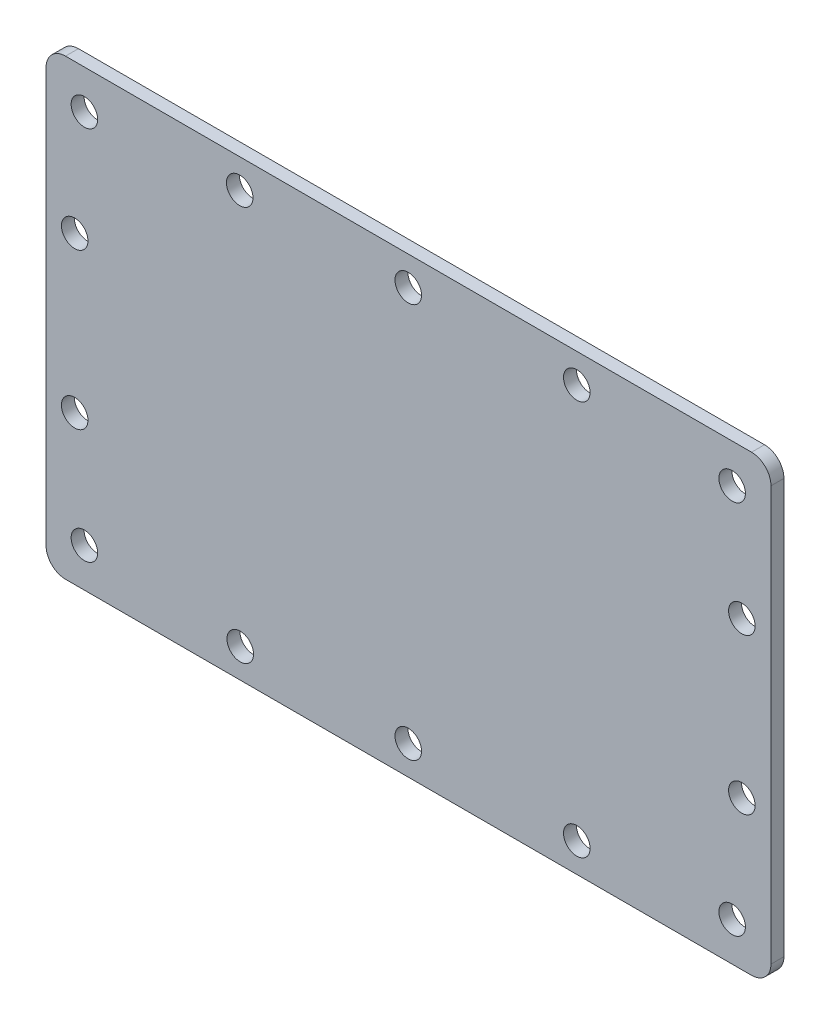
ISO-10303-21;
HEADER;
FILE_DESCRIPTION(('STEP AP214'),'2;1');
FILE_NAME('part.step','',(''),(''),'','','');
FILE_SCHEMA(('AUTOMOTIVE_DESIGN { 1 0 10303 214 1 1 1 1 }'));
ENDSEC;
DATA;
#1=APPLICATION_CONTEXT('core data for automotive mechanical design processes');
#2=APPLICATION_PROTOCOL_DEFINITION('international standard','automotive_design',2000,#1);
#3=PRODUCT_CONTEXT('',#1,'mechanical');
#4=PRODUCT('Part','Part','',(#3));
#5=PRODUCT_RELATED_PRODUCT_CATEGORY('part','',(#4));
#6=PRODUCT_DEFINITION_FORMATION('','',#4);
#7=PRODUCT_DEFINITION_CONTEXT('part definition',#1,'design');
#8=PRODUCT_DEFINITION('design','',#6,#7);
#9=PRODUCT_DEFINITION_SHAPE('','',#8);
#10=(LENGTH_UNIT() NAMED_UNIT(*) SI_UNIT(.MILLI.,.METRE.));
#11=(NAMED_UNIT(*) PLANE_ANGLE_UNIT() SI_UNIT($,.RADIAN.));
#12=(NAMED_UNIT(*) SI_UNIT($,.STERADIAN.) SOLID_ANGLE_UNIT());
#13=UNCERTAINTY_MEASURE_WITH_UNIT(LENGTH_MEASURE(1.E-05),#10,'distance_accuracy_value','');
#14=(GEOMETRIC_REPRESENTATION_CONTEXT(3) GLOBAL_UNCERTAINTY_ASSIGNED_CONTEXT((#13)) GLOBAL_UNIT_ASSIGNED_CONTEXT((#10,
#11,#12)) REPRESENTATION_CONTEXT('',''));
#15=CARTESIAN_POINT('',(0.,0.,0.));
#16=DIRECTION('',(0.,0.,1.));
#17=DIRECTION('',(1.,0.,0.));
#18=AXIS2_PLACEMENT_3D('',#15,#16,#17);
#19=CARTESIAN_POINT('',(-90.1914606741827,7.93230490078483,2.));
#20=DIRECTION('',(1.,0.,0.));
#21=DIRECTION('',(0.,1.,0.));
#22=AXIS2_PLACEMENT_3D('',#19,#20,#21);
#23=PLANE('',#22);
#24=DIRECTION('',(0.,-1.,0.));
#25=VECTOR('',#24,1.);
#26=CARTESIAN_POINT('',(-90.1914606741827,7.93230490078483,0.));
#27=LINE('',#26,#25);
#28=CARTESIAN_POINT('',(-90.1914606741827,4.93230490078483,0.));
#29=VERTEX_POINT('',#28);
#30=CARTESIAN_POINT('',(-90.1914606741827,-59.0676950992152,0.));
#31=VERTEX_POINT('',#30);
#32=EDGE_CURVE('E130',#29,#31,#27,.T.);
#33=ORIENTED_EDGE('',*,*,#32,.T.);
#34=DIRECTION('',(0.,0.,-1.));
#35=VECTOR('',#34,1.);
#36=CARTESIAN_POINT('',(-90.1914606741827,-59.0676950992152,2.));
#37=LINE('',#36,#35);
#38=CARTESIAN_POINT('',(-90.1914606741827,-59.0676950992152,2.));
#39=VERTEX_POINT('',#38);
#40=EDGE_CURVE('E107',#31,#39,#37,.F.);
#41=ORIENTED_EDGE('',*,*,#40,.T.);
#42=DIRECTION('',(0.,-1.,0.));
#43=VECTOR('',#42,1.);
#44=CARTESIAN_POINT('',(-90.1914606741827,7.93230490078483,2.));
#45=LINE('',#44,#43);
#46=CARTESIAN_POINT('',(-90.1914606741827,4.93230490078483,2.));
#47=VERTEX_POINT('',#46);
#48=EDGE_CURVE('E140',#47,#39,#45,.T.);
#49=ORIENTED_EDGE('',*,*,#48,.F.);
#50=DIRECTION('',(0.,0.,-1.));
#51=VECTOR('',#50,1.);
#52=CARTESIAN_POINT('',(-90.1914606741827,4.93230490078483,2.));
#53=LINE('',#52,#51);
#54=EDGE_CURVE('E112',#47,#29,#53,.T.);
#55=ORIENTED_EDGE('',*,*,#54,.T.);
#56=EDGE_LOOP('',(#33,#41,#49,#55));
#57=FACE_BOUND('',#56,.T.);
#58=ADVANCED_FACE('F33',(#57),#23,.F.);
#59=CARTESIAN_POINT('',(-90.1914606741827,-62.0676950992152,2.));
#60=DIRECTION('',(0.,1.,0.));
#61=DIRECTION('',(0.,0.,1.));
#62=AXIS2_PLACEMENT_3D('',#59,#60,#61);
#63=PLANE('',#62);
#64=DIRECTION('',(1.,0.,0.));
#65=VECTOR('',#64,1.);
#66=CARTESIAN_POINT('',(-90.1914606741827,-62.0676950992152,2.));
#67=LINE('',#66,#65);
#68=CARTESIAN_POINT('',(-87.1914606741827,-62.0676950992152,2.));
#69=VERTEX_POINT('',#68);
#70=CARTESIAN_POINT('',(18.8085393258173,-62.0676950992152,2.));
#71=VERTEX_POINT('',#70);
#72=EDGE_CURVE('E122',#69,#71,#67,.T.);
#73=ORIENTED_EDGE('',*,*,#72,.F.);
#74=DIRECTION('',(0.,0.,-1.));
#75=VECTOR('',#74,1.);
#76=CARTESIAN_POINT('',(-87.1914606741827,-62.0676950992152,2.));
#77=LINE('',#76,#75);
#78=CARTESIAN_POINT('',(-87.1914606741827,-62.0676950992152,0.));
#79=VERTEX_POINT('',#78);
#80=EDGE_CURVE('E106',#69,#79,#77,.T.);
#81=ORIENTED_EDGE('',*,*,#80,.T.);
#82=DIRECTION('',(1.,0.,0.));
#83=VECTOR('',#82,1.);
#84=CARTESIAN_POINT('',(-90.1914606741827,-62.0676950992152,0.));
#85=LINE('',#84,#83);
#86=CARTESIAN_POINT('',(18.8085393258173,-62.0676950992152,0.));
#87=VERTEX_POINT('',#86);
#88=EDGE_CURVE('E119',#79,#87,#85,.T.);
#89=ORIENTED_EDGE('',*,*,#88,.T.);
#90=DIRECTION('',(0.,0.,-1.));
#91=VECTOR('',#90,1.);
#92=CARTESIAN_POINT('',(18.8085393258173,-62.0676950992152,2.));
#93=LINE('',#92,#91);
#94=EDGE_CURVE('E124',#87,#71,#93,.F.);
#95=ORIENTED_EDGE('',*,*,#94,.T.);
#96=EDGE_LOOP('',(#73,#81,#89,#95));
#97=FACE_BOUND('',#96,.T.);
#98=ADVANCED_FACE('F118',(#97),#63,.F.);
#99=CARTESIAN_POINT('',(21.8085393258173,7.93230490078483,2.));
#100=DIRECTION('',(-1.,0.,0.));
#101=DIRECTION('',(0.,-1.,0.));
#102=AXIS2_PLACEMENT_3D('',#99,#100,#101);
#103=PLANE('',#102);
#104=DIRECTION('',(0.,1.,0.));
#105=VECTOR('',#104,1.);
#106=CARTESIAN_POINT('',(21.8085393258173,7.93230490078483,2.));
#107=LINE('',#106,#105);
#108=CARTESIAN_POINT('',(21.8085393258173,-59.0676950992152,2.));
#109=VERTEX_POINT('',#108);
#110=CARTESIAN_POINT('',(21.8085393258173,4.93230490078483,2.));
#111=VERTEX_POINT('',#110);
#112=EDGE_CURVE('E247',#109,#111,#107,.T.);
#113=ORIENTED_EDGE('',*,*,#112,.F.);
#114=DIRECTION('',(0.,0.,-1.));
#115=VECTOR('',#114,1.);
#116=CARTESIAN_POINT('',(21.8085393258173,-59.0676950992152,2.));
#117=LINE('',#116,#115);
#118=CARTESIAN_POINT('',(21.8085393258173,-59.0676950992152,0.));
#119=VERTEX_POINT('',#118);
#120=EDGE_CURVE('E11',#109,#119,#117,.T.);
#121=ORIENTED_EDGE('',*,*,#120,.T.);
#122=DIRECTION('',(0.,1.,0.));
#123=VECTOR('',#122,1.);
#124=CARTESIAN_POINT('',(21.8085393258173,7.93230490078483,0.));
#125=LINE('',#124,#123);
#126=CARTESIAN_POINT('',(21.8085393258173,4.93230490078483,0.));
#127=VERTEX_POINT('',#126);
#128=EDGE_CURVE('E129',#119,#127,#125,.T.);
#129=ORIENTED_EDGE('',*,*,#128,.T.);
#130=DIRECTION('',(0.,0.,-1.));
#131=VECTOR('',#130,1.);
#132=CARTESIAN_POINT('',(21.8085393258173,4.93230490078483,2.));
#133=LINE('',#132,#131);
#134=EDGE_CURVE('E42',#127,#111,#133,.F.);
#135=ORIENTED_EDGE('',*,*,#134,.T.);
#136=EDGE_LOOP('',(#113,#121,#129,#135));
#137=FACE_BOUND('',#136,.T.);
#138=ADVANCED_FACE('F262',(#137),#103,.F.);
#139=CARTESIAN_POINT('',(-90.1914606741827,7.93230490078483,2.));
#140=DIRECTION('',(0.,-1.,0.));
#141=DIRECTION('',(0.,0.,-1.));
#142=AXIS2_PLACEMENT_3D('',#139,#140,#141);
#143=PLANE('',#142);
#144=DIRECTION('',(-1.,0.,0.));
#145=VECTOR('',#144,1.);
#146=CARTESIAN_POINT('',(-90.1914606741827,7.93230490078483,0.));
#147=LINE('',#146,#145);
#148=CARTESIAN_POINT('',(18.8085393258173,7.93230490078483,0.));
#149=VERTEX_POINT('',#148);
#150=CARTESIAN_POINT('',(-87.1914606741827,7.93230490078483,0.));
#151=VERTEX_POINT('',#150);
#152=EDGE_CURVE('E133',#149,#151,#147,.T.);
#153=ORIENTED_EDGE('',*,*,#152,.T.);
#154=DIRECTION('',(0.,0.,-1.));
#155=VECTOR('',#154,1.);
#156=CARTESIAN_POINT('',(-87.1914606741827,7.93230490078483,2.));
#157=LINE('',#156,#155);
#158=CARTESIAN_POINT('',(-87.1914606741827,7.93230490078483,2.));
#159=VERTEX_POINT('',#158);
#160=EDGE_CURVE('E50',#151,#159,#157,.F.);
#161=ORIENTED_EDGE('',*,*,#160,.T.);
#162=DIRECTION('',(-1.,0.,0.));
#163=VECTOR('',#162,1.);
#164=CARTESIAN_POINT('',(-90.1914606741827,7.93230490078483,2.));
#165=LINE('',#164,#163);
#166=CARTESIAN_POINT('',(18.8085393258173,7.93230490078483,2.));
#167=VERTEX_POINT('',#166);
#168=EDGE_CURVE('E141',#167,#159,#165,.T.);
#169=ORIENTED_EDGE('',*,*,#168,.F.);
#170=DIRECTION('',(0.,0.,-1.));
#171=VECTOR('',#170,1.);
#172=CARTESIAN_POINT('',(18.8085393258173,7.93230490078483,2.));
#173=LINE('',#172,#171);
#174=EDGE_CURVE('E156',#167,#149,#173,.T.);
#175=ORIENTED_EDGE('',*,*,#174,.T.);
#176=EDGE_LOOP('',(#153,#161,#169,#175));
#177=FACE_BOUND('',#176,.T.);
#178=ADVANCED_FACE('F257',(#177),#143,.F.);
#179=CARTESIAN_POINT('',(0.,0.,2.));
#180=DIRECTION('',(0.,0.,1.));
#181=DIRECTION('',(1.,0.,0.));
#182=AXIS2_PLACEMENT_3D('',#179,#180,#181);
#183=PLANE('',#182);
#184=CARTESIAN_POINT('',(15.8085393258173,1.93230490078483,2.));
#185=DIRECTION('',(0.,0.,1.));
#186=DIRECTION('',(1.,0.,0.));
#187=AXIS2_PLACEMENT_3D('',#184,#185,#186);
#188=CIRCLE('',#187,2.05);
#189=CARTESIAN_POINT('',(17.8585393258173,1.93230490078483,2.));
#190=VERTEX_POINT('',#189);
#191=EDGE_CURVE('E219',#190,#190,#188,.T.);
#192=ORIENTED_EDGE('',*,*,#191,.F.);
#193=EDGE_LOOP('',(#192));
#194=FACE_BOUND('',#193,.T.);
#195=CARTESIAN_POINT('',(17.3085393258173,-15.0676950992152,2.));
#196=DIRECTION('',(0.,0.,1.));
#197=DIRECTION('',(1.,0.,0.));
#198=AXIS2_PLACEMENT_3D('',#195,#196,#197);
#199=CIRCLE('',#198,2.05);
#200=CARTESIAN_POINT('',(19.3585393258173,-15.0676950992152,2.));
#201=VERTEX_POINT('',#200);
#202=EDGE_CURVE('E209',#201,#201,#199,.T.);
#203=ORIENTED_EDGE('',*,*,#202,.F.);
#204=EDGE_LOOP('',(#203));
#205=FACE_BOUND('',#204,.T.);
#206=CARTESIAN_POINT('',(17.3085393258173,-39.0676950992152,2.));
#207=DIRECTION('',(0.,0.,1.));
#208=DIRECTION('',(1.,0.,0.));
#209=AXIS2_PLACEMENT_3D('',#206,#207,#208);
#210=CIRCLE('',#209,2.05);
#211=CARTESIAN_POINT('',(19.3585393258173,-39.0676950992152,2.));
#212=VERTEX_POINT('',#211);
#213=EDGE_CURVE('E206',#212,#212,#210,.T.);
#214=ORIENTED_EDGE('',*,*,#213,.F.);
#215=EDGE_LOOP('',(#214));
#216=FACE_BOUND('',#215,.T.);
#217=CARTESIAN_POINT('',(15.8085393258173,-56.0676950992152,2.));
#218=DIRECTION('',(0.,0.,1.));
#219=DIRECTION('',(1.,0.,0.));
#220=AXIS2_PLACEMENT_3D('',#217,#218,#219);
#221=CIRCLE('',#220,2.05);
#222=CARTESIAN_POINT('',(17.8585393258173,-56.0676950992152,2.));
#223=VERTEX_POINT('',#222);
#224=EDGE_CURVE('E203',#223,#223,#221,.T.);
#225=ORIENTED_EDGE('',*,*,#224,.F.);
#226=EDGE_LOOP('',(#225));
#227=FACE_BOUND('',#226,.T.);
#228=CARTESIAN_POINT('',(-8.19146067418266,-57.5676950992152,2.));
#229=DIRECTION('',(0.,0.,1.));
#230=DIRECTION('',(1.,0.,0.));
#231=AXIS2_PLACEMENT_3D('',#228,#229,#230);
#232=CIRCLE('',#231,2.04999999999999);
#233=CARTESIAN_POINT('',(-6.14146067418267,-57.5676950992152,2.));
#234=VERTEX_POINT('',#233);
#235=EDGE_CURVE('E199',#234,#234,#232,.T.);
#236=ORIENTED_EDGE('',*,*,#235,.F.);
#237=EDGE_LOOP('',(#236));
#238=FACE_BOUND('',#237,.T.);
#239=CARTESIAN_POINT('',(-8.19146067418271,3.43230490078483,2.));
#240=DIRECTION('',(0.,0.,1.));
#241=DIRECTION('',(1.,0.,0.));
#242=AXIS2_PLACEMENT_3D('',#239,#240,#241);
#243=CIRCLE('',#242,2.05);
#244=CARTESIAN_POINT('',(-6.14146067418271,3.43230490078483,2.));
#245=VERTEX_POINT('',#244);
#246=EDGE_CURVE('E195',#245,#245,#243,.T.);
#247=ORIENTED_EDGE('',*,*,#246,.F.);
#248=EDGE_LOOP('',(#247));
#249=FACE_BOUND('',#248,.T.);
#250=CARTESIAN_POINT('',(-34.2318692488312,3.43230490078482,2.));
#251=DIRECTION('',(0.,0.,1.));
#252=DIRECTION('',(1.,0.,0.));
#253=AXIS2_PLACEMENT_3D('',#250,#251,#252);
#254=CIRCLE('',#253,2.05);
#255=CARTESIAN_POINT('',(-32.1818692488312,3.43230490078482,2.));
#256=VERTEX_POINT('',#255);
#257=EDGE_CURVE('E191',#256,#256,#254,.T.);
#258=ORIENTED_EDGE('',*,*,#257,.F.);
#259=EDGE_LOOP('',(#258));
#260=FACE_BOUND('',#259,.T.);
#261=CARTESIAN_POINT('',(-34.2318692488311,-57.5676950992152,2.));
#262=DIRECTION('',(0.,0.,1.));
#263=DIRECTION('',(1.,0.,0.));
#264=AXIS2_PLACEMENT_3D('',#261,#262,#263);
#265=CIRCLE('',#264,2.05);
#266=CARTESIAN_POINT('',(-32.1818692488311,-57.5676950992152,2.));
#267=VERTEX_POINT('',#266);
#268=EDGE_CURVE('E187',#267,#267,#265,.T.);
#269=ORIENTED_EDGE('',*,*,#268,.F.);
#270=EDGE_LOOP('',(#269));
#271=FACE_BOUND('',#270,.T.);
#272=CARTESIAN_POINT('',(-60.1914606741827,-57.5676950992151,2.));
#273=DIRECTION('',(0.,0.,1.));
#274=DIRECTION('',(1.,0.,0.));
#275=AXIS2_PLACEMENT_3D('',#272,#273,#274);
#276=CIRCLE('',#275,2.05000000000001);
#277=CARTESIAN_POINT('',(-58.1414606741827,-57.5676950992151,2.));
#278=VERTEX_POINT('',#277);
#279=EDGE_CURVE('E183',#278,#278,#276,.T.);
#280=ORIENTED_EDGE('',*,*,#279,.F.);
#281=EDGE_LOOP('',(#280));
#282=FACE_BOUND('',#281,.T.);
#283=CARTESIAN_POINT('',(-60.2722778234797,3.43230490078481,2.));
#284=DIRECTION('',(0.,0.,1.));
#285=DIRECTION('',(1.,0.,0.));
#286=AXIS2_PLACEMENT_3D('',#283,#284,#285);
#287=CIRCLE('',#286,2.05);
#288=CARTESIAN_POINT('',(-58.2222778234797,3.43230490078481,2.));
#289=VERTEX_POINT('',#288);
#290=EDGE_CURVE('E179',#289,#289,#287,.T.);
#291=ORIENTED_EDGE('',*,*,#290,.F.);
#292=EDGE_LOOP('',(#291));
#293=FACE_BOUND('',#292,.T.);
#294=CARTESIAN_POINT('',(-84.2722778234797,1.9323049007848,2.));
#295=DIRECTION('',(0.,0.,1.));
#296=DIRECTION('',(1.,0.,0.));
#297=AXIS2_PLACEMENT_3D('',#294,#295,#296);
#298=CIRCLE('',#297,2.04999999999999);
#299=CARTESIAN_POINT('',(-82.2222778234797,1.9323049007848,2.));
#300=VERTEX_POINT('',#299);
#301=EDGE_CURVE('E175',#300,#300,#298,.T.);
#302=ORIENTED_EDGE('',*,*,#301,.F.);
#303=EDGE_LOOP('',(#302));
#304=FACE_BOUND('',#303,.T.);
#305=CARTESIAN_POINT('',(-85.7722778234797,-15.0676950992152,2.));
#306=DIRECTION('',(0.,0.,1.));
#307=DIRECTION('',(1.,0.,0.));
#308=AXIS2_PLACEMENT_3D('',#305,#306,#307);
#309=CIRCLE('',#308,2.04999999999999);
#310=CARTESIAN_POINT('',(-83.7222778234797,-15.0676950992152,2.));
#311=VERTEX_POINT('',#310);
#312=EDGE_CURVE('E171',#311,#311,#309,.T.);
#313=ORIENTED_EDGE('',*,*,#312,.F.);
#314=EDGE_LOOP('',(#313));
#315=FACE_BOUND('',#314,.T.);
#316=CARTESIAN_POINT('',(-85.7722778234797,-39.0676950992152,2.));
#317=DIRECTION('',(0.,0.,1.));
#318=DIRECTION('',(1.,0.,0.));
#319=AXIS2_PLACEMENT_3D('',#316,#317,#318);
#320=CIRCLE('',#319,2.04999999999999);
#321=CARTESIAN_POINT('',(-83.7222778234797,-39.0676950992152,2.));
#322=VERTEX_POINT('',#321);
#323=EDGE_CURVE('E167',#322,#322,#320,.T.);
#324=ORIENTED_EDGE('',*,*,#323,.F.);
#325=EDGE_LOOP('',(#324));
#326=FACE_BOUND('',#325,.T.);
#327=CARTESIAN_POINT('',(-84.2722778234796,-56.0676950992152,2.));
#328=DIRECTION('',(0.,0.,1.));
#329=DIRECTION('',(1.,0.,0.));
#330=AXIS2_PLACEMENT_3D('',#327,#328,#329);
#331=CIRCLE('',#330,2.05000000000001);
#332=CARTESIAN_POINT('',(-82.2222778234796,-56.0676950992152,2.));
#333=VERTEX_POINT('',#332);
#334=EDGE_CURVE('E163',#333,#333,#331,.T.);
#335=ORIENTED_EDGE('',*,*,#334,.F.);
#336=EDGE_LOOP('',(#335));
#337=FACE_BOUND('',#336,.T.);
#338=ORIENTED_EDGE('',*,*,#48,.T.);
#339=CARTESIAN_POINT('',(-87.1914606741827,-59.0676950992152,2.));
#340=DIRECTION('',(0.,0.,1.));
#341=DIRECTION('',(1.,0.,0.));
#342=AXIS2_PLACEMENT_3D('',#339,#340,#341);
#343=CIRCLE('',#342,3.);
#344=EDGE_CURVE('E154',#39,#69,#343,.T.);
#345=ORIENTED_EDGE('',*,*,#344,.T.);
#346=ORIENTED_EDGE('',*,*,#72,.T.);
#347=CARTESIAN_POINT('',(18.8085393258173,-59.0676950992152,2.));
#348=DIRECTION('',(0.,0.,1.));
#349=DIRECTION('',(1.,0.,0.));
#350=AXIS2_PLACEMENT_3D('',#347,#348,#349);
#351=CIRCLE('',#350,3.);
#352=EDGE_CURVE('E150',#71,#109,#351,.T.);
#353=ORIENTED_EDGE('',*,*,#352,.T.);
#354=ORIENTED_EDGE('',*,*,#112,.T.);
#355=CARTESIAN_POINT('',(18.8085393258173,4.93230490078483,2.));
#356=DIRECTION('',(0.,0.,1.));
#357=DIRECTION('',(1.,0.,0.));
#358=AXIS2_PLACEMENT_3D('',#355,#356,#357);
#359=CIRCLE('',#358,3.);
#360=EDGE_CURVE('E57',#111,#167,#359,.T.);
#361=ORIENTED_EDGE('',*,*,#360,.T.);
#362=ORIENTED_EDGE('',*,*,#168,.T.);
#363=CARTESIAN_POINT('',(-87.1914606741827,4.93230490078483,2.));
#364=DIRECTION('',(0.,0.,1.));
#365=DIRECTION('',(1.,0.,0.));
#366=AXIS2_PLACEMENT_3D('',#363,#364,#365);
#367=CIRCLE('',#366,3.);
#368=EDGE_CURVE('E152',#159,#47,#367,.T.);
#369=ORIENTED_EDGE('',*,*,#368,.T.);
#370=EDGE_LOOP('',(#338,#345,#346,#353,#354,#361,#362,#369));
#371=FACE_BOUND('',#370,.T.);
#372=ADVANCED_FACE('F249',(#194,#205,#216,#227,#238,#249,#260,#271,#282,#293,#304,#315,#326,
#337,#371),#183,.T.);
#373=CARTESIAN_POINT('',(0.,0.,0.));
#374=DIRECTION('',(0.,0.,1.));
#375=DIRECTION('',(1.,0.,0.));
#376=AXIS2_PLACEMENT_3D('',#373,#374,#375);
#377=PLANE('',#376);
#378=CARTESIAN_POINT('',(15.8085393258173,1.93230490078483,0.));
#379=DIRECTION('',(0.,0.,1.));
#380=DIRECTION('',(1.,0.,0.));
#381=AXIS2_PLACEMENT_3D('',#378,#379,#380);
#382=CIRCLE('',#381,2.05);
#383=CARTESIAN_POINT('',(17.8585393258173,1.93230490078483,0.));
#384=VERTEX_POINT('',#383);
#385=EDGE_CURVE('E37',#384,#384,#382,.T.);
#386=ORIENTED_EDGE('',*,*,#385,.T.);
#387=EDGE_LOOP('',(#386));
#388=FACE_BOUND('',#387,.T.);
#389=CARTESIAN_POINT('',(17.3085393258173,-15.0676950992152,0.));
#390=DIRECTION('',(0.,0.,1.));
#391=DIRECTION('',(1.,0.,0.));
#392=AXIS2_PLACEMENT_3D('',#389,#390,#391);
#393=CIRCLE('',#392,2.05);
#394=CARTESIAN_POINT('',(19.3585393258173,-15.0676950992152,0.));
#395=VERTEX_POINT('',#394);
#396=EDGE_CURVE('E207',#395,#395,#393,.T.);
#397=ORIENTED_EDGE('',*,*,#396,.T.);
#398=EDGE_LOOP('',(#397));
#399=FACE_BOUND('',#398,.T.);
#400=CARTESIAN_POINT('',(17.3085393258173,-39.0676950992152,0.));
#401=DIRECTION('',(0.,0.,1.));
#402=DIRECTION('',(1.,0.,0.));
#403=AXIS2_PLACEMENT_3D('',#400,#401,#402);
#404=CIRCLE('',#403,2.05);
#405=CARTESIAN_POINT('',(19.3585393258173,-39.0676950992152,0.));
#406=VERTEX_POINT('',#405);
#407=EDGE_CURVE('E204',#406,#406,#404,.T.);
#408=ORIENTED_EDGE('',*,*,#407,.T.);
#409=EDGE_LOOP('',(#408));
#410=FACE_BOUND('',#409,.T.);
#411=CARTESIAN_POINT('',(15.8085393258173,-56.0676950992152,0.));
#412=DIRECTION('',(0.,0.,1.));
#413=DIRECTION('',(1.,0.,0.));
#414=AXIS2_PLACEMENT_3D('',#411,#412,#413);
#415=CIRCLE('',#414,2.05);
#416=CARTESIAN_POINT('',(17.8585393258173,-56.0676950992152,0.));
#417=VERTEX_POINT('',#416);
#418=EDGE_CURVE('E200',#417,#417,#415,.T.);
#419=ORIENTED_EDGE('',*,*,#418,.T.);
#420=EDGE_LOOP('',(#419));
#421=FACE_BOUND('',#420,.T.);
#422=CARTESIAN_POINT('',(-8.19146067418266,-57.5676950992152,0.));
#423=DIRECTION('',(0.,0.,1.));
#424=DIRECTION('',(1.,0.,0.));
#425=AXIS2_PLACEMENT_3D('',#422,#423,#424);
#426=CIRCLE('',#425,2.04999999999999);
#427=CARTESIAN_POINT('',(-6.14146067418267,-57.5676950992152,0.));
#428=VERTEX_POINT('',#427);
#429=EDGE_CURVE('E196',#428,#428,#426,.T.);
#430=ORIENTED_EDGE('',*,*,#429,.T.);
#431=EDGE_LOOP('',(#430));
#432=FACE_BOUND('',#431,.T.);
#433=CARTESIAN_POINT('',(-8.19146067418271,3.43230490078483,0.));
#434=DIRECTION('',(0.,0.,1.));
#435=DIRECTION('',(1.,0.,0.));
#436=AXIS2_PLACEMENT_3D('',#433,#434,#435);
#437=CIRCLE('',#436,2.05);
#438=CARTESIAN_POINT('',(-6.14146067418271,3.43230490078483,0.));
#439=VERTEX_POINT('',#438);
#440=EDGE_CURVE('E192',#439,#439,#437,.T.);
#441=ORIENTED_EDGE('',*,*,#440,.T.);
#442=EDGE_LOOP('',(#441));
#443=FACE_BOUND('',#442,.T.);
#444=CARTESIAN_POINT('',(-34.2318692488312,3.43230490078482,0.));
#445=DIRECTION('',(0.,0.,1.));
#446=DIRECTION('',(1.,0.,0.));
#447=AXIS2_PLACEMENT_3D('',#444,#445,#446);
#448=CIRCLE('',#447,2.05);
#449=CARTESIAN_POINT('',(-32.1818692488312,3.43230490078482,0.));
#450=VERTEX_POINT('',#449);
#451=EDGE_CURVE('E188',#450,#450,#448,.T.);
#452=ORIENTED_EDGE('',*,*,#451,.T.);
#453=EDGE_LOOP('',(#452));
#454=FACE_BOUND('',#453,.T.);
#455=CARTESIAN_POINT('',(-34.2318692488311,-57.5676950992152,0.));
#456=DIRECTION('',(0.,0.,1.));
#457=DIRECTION('',(1.,0.,0.));
#458=AXIS2_PLACEMENT_3D('',#455,#456,#457);
#459=CIRCLE('',#458,2.05);
#460=CARTESIAN_POINT('',(-32.1818692488311,-57.5676950992152,0.));
#461=VERTEX_POINT('',#460);
#462=EDGE_CURVE('E184',#461,#461,#459,.T.);
#463=ORIENTED_EDGE('',*,*,#462,.T.);
#464=EDGE_LOOP('',(#463));
#465=FACE_BOUND('',#464,.T.);
#466=CARTESIAN_POINT('',(-60.1914606741827,-57.5676950992151,0.));
#467=DIRECTION('',(0.,0.,1.));
#468=DIRECTION('',(1.,0.,0.));
#469=AXIS2_PLACEMENT_3D('',#466,#467,#468);
#470=CIRCLE('',#469,2.05000000000001);
#471=CARTESIAN_POINT('',(-58.1414606741827,-57.5676950992151,0.));
#472=VERTEX_POINT('',#471);
#473=EDGE_CURVE('E180',#472,#472,#470,.T.);
#474=ORIENTED_EDGE('',*,*,#473,.T.);
#475=EDGE_LOOP('',(#474));
#476=FACE_BOUND('',#475,.T.);
#477=CARTESIAN_POINT('',(-60.2722778234797,3.43230490078481,0.));
#478=DIRECTION('',(0.,0.,1.));
#479=DIRECTION('',(1.,0.,0.));
#480=AXIS2_PLACEMENT_3D('',#477,#478,#479);
#481=CIRCLE('',#480,2.05);
#482=CARTESIAN_POINT('',(-58.2222778234797,3.43230490078481,0.));
#483=VERTEX_POINT('',#482);
#484=EDGE_CURVE('E176',#483,#483,#481,.T.);
#485=ORIENTED_EDGE('',*,*,#484,.T.);
#486=EDGE_LOOP('',(#485));
#487=FACE_BOUND('',#486,.T.);
#488=CARTESIAN_POINT('',(-84.2722778234797,1.9323049007848,0.));
#489=DIRECTION('',(0.,0.,1.));
#490=DIRECTION('',(1.,0.,0.));
#491=AXIS2_PLACEMENT_3D('',#488,#489,#490);
#492=CIRCLE('',#491,2.04999999999999);
#493=CARTESIAN_POINT('',(-82.2222778234797,1.9323049007848,0.));
#494=VERTEX_POINT('',#493);
#495=EDGE_CURVE('E172',#494,#494,#492,.T.);
#496=ORIENTED_EDGE('',*,*,#495,.T.);
#497=EDGE_LOOP('',(#496));
#498=FACE_BOUND('',#497,.T.);
#499=CARTESIAN_POINT('',(-85.7722778234797,-15.0676950992152,0.));
#500=DIRECTION('',(0.,0.,1.));
#501=DIRECTION('',(1.,0.,0.));
#502=AXIS2_PLACEMENT_3D('',#499,#500,#501);
#503=CIRCLE('',#502,2.04999999999999);
#504=CARTESIAN_POINT('',(-83.7222778234797,-15.0676950992152,0.));
#505=VERTEX_POINT('',#504);
#506=EDGE_CURVE('E168',#505,#505,#503,.T.);
#507=ORIENTED_EDGE('',*,*,#506,.T.);
#508=EDGE_LOOP('',(#507));
#509=FACE_BOUND('',#508,.T.);
#510=CARTESIAN_POINT('',(-85.7722778234797,-39.0676950992152,0.));
#511=DIRECTION('',(0.,0.,1.));
#512=DIRECTION('',(1.,0.,0.));
#513=AXIS2_PLACEMENT_3D('',#510,#511,#512);
#514=CIRCLE('',#513,2.04999999999999);
#515=CARTESIAN_POINT('',(-83.7222778234797,-39.0676950992152,0.));
#516=VERTEX_POINT('',#515);
#517=EDGE_CURVE('E164',#516,#516,#514,.T.);
#518=ORIENTED_EDGE('',*,*,#517,.T.);
#519=EDGE_LOOP('',(#518));
#520=FACE_BOUND('',#519,.T.);
#521=CARTESIAN_POINT('',(-84.2722778234796,-56.0676950992152,0.));
#522=DIRECTION('',(0.,0.,1.));
#523=DIRECTION('',(1.,0.,0.));
#524=AXIS2_PLACEMENT_3D('',#521,#522,#523);
#525=CIRCLE('',#524,2.05000000000001);
#526=CARTESIAN_POINT('',(-82.2222778234796,-56.0676950992152,0.));
#527=VERTEX_POINT('',#526);
#528=EDGE_CURVE('E135',#527,#527,#525,.T.);
#529=ORIENTED_EDGE('',*,*,#528,.T.);
#530=EDGE_LOOP('',(#529));
#531=FACE_BOUND('',#530,.T.);
#532=ORIENTED_EDGE('',*,*,#88,.F.);
#533=CARTESIAN_POINT('',(-87.1914606741827,-59.0676950992152,0.));
#534=DIRECTION('',(0.,0.,1.));
#535=DIRECTION('',(1.,0.,0.));
#536=AXIS2_PLACEMENT_3D('',#533,#534,#535);
#537=CIRCLE('',#536,3.);
#538=EDGE_CURVE('E102',#79,#31,#537,.F.);
#539=ORIENTED_EDGE('',*,*,#538,.T.);
#540=ORIENTED_EDGE('',*,*,#32,.F.);
#541=CARTESIAN_POINT('',(-87.1914606741827,4.93230490078483,0.));
#542=DIRECTION('',(0.,0.,1.));
#543=DIRECTION('',(1.,0.,0.));
#544=AXIS2_PLACEMENT_3D('',#541,#542,#543);
#545=CIRCLE('',#544,3.);
#546=EDGE_CURVE('E113',#29,#151,#545,.F.);
#547=ORIENTED_EDGE('',*,*,#546,.T.);
#548=ORIENTED_EDGE('',*,*,#152,.F.);
#549=CARTESIAN_POINT('',(18.8085393258173,4.93230490078483,0.));
#550=DIRECTION('',(0.,0.,1.));
#551=DIRECTION('',(1.,0.,0.));
#552=AXIS2_PLACEMENT_3D('',#549,#550,#551);
#553=CIRCLE('',#552,3.);
#554=EDGE_CURVE('E123',#149,#127,#553,.F.);
#555=ORIENTED_EDGE('',*,*,#554,.T.);
#556=ORIENTED_EDGE('',*,*,#128,.F.);
#557=CARTESIAN_POINT('',(18.8085393258173,-59.0676950992152,0.));
#558=DIRECTION('',(0.,0.,1.));
#559=DIRECTION('',(1.,0.,0.));
#560=AXIS2_PLACEMENT_3D('',#557,#558,#559);
#561=CIRCLE('',#560,3.);
#562=EDGE_CURVE('E128',#119,#87,#561,.F.);
#563=ORIENTED_EDGE('',*,*,#562,.T.);
#564=EDGE_LOOP('',(#532,#539,#540,#547,#548,#555,#556,#563));
#565=FACE_BOUND('',#564,.T.);
#566=ADVANCED_FACE('F126',(#388,#399,#410,#421,#432,#443,#454,#465,#476,#487,#498,#509,#520,
#531,#565),#377,.F.);
#567=CARTESIAN_POINT('',(-87.1914606741827,-59.0676950992152,2.));
#568=DIRECTION('',(0.,0.,-1.));
#569=DIRECTION('',(-1.,0.,0.));
#570=AXIS2_PLACEMENT_3D('',#567,#568,#569);
#571=CYLINDRICAL_SURFACE('',#570,3.);
#572=ORIENTED_EDGE('',*,*,#344,.F.);
#573=ORIENTED_EDGE('',*,*,#40,.F.);
#574=ORIENTED_EDGE('',*,*,#538,.F.);
#575=ORIENTED_EDGE('',*,*,#80,.F.);
#576=EDGE_LOOP('',(#572,#573,#574,#575));
#577=FACE_BOUND('',#576,.T.);
#578=ADVANCED_FACE('F105',(#577),#571,.T.);
#579=CARTESIAN_POINT('',(-87.1914606741827,4.93230490078483,2.));
#580=DIRECTION('',(0.,0.,-1.));
#581=DIRECTION('',(-1.,0.,0.));
#582=AXIS2_PLACEMENT_3D('',#579,#580,#581);
#583=CYLINDRICAL_SURFACE('',#582,3.);
#584=ORIENTED_EDGE('',*,*,#368,.F.);
#585=ORIENTED_EDGE('',*,*,#160,.F.);
#586=ORIENTED_EDGE('',*,*,#546,.F.);
#587=ORIENTED_EDGE('',*,*,#54,.F.);
#588=EDGE_LOOP('',(#584,#585,#586,#587));
#589=FACE_BOUND('',#588,.T.);
#590=ADVANCED_FACE('F254',(#589),#583,.T.);
#591=CARTESIAN_POINT('',(18.8085393258173,-59.0676950992152,2.));
#592=DIRECTION('',(0.,0.,-1.));
#593=DIRECTION('',(-1.,0.,0.));
#594=AXIS2_PLACEMENT_3D('',#591,#592,#593);
#595=CYLINDRICAL_SURFACE('',#594,3.);
#596=ORIENTED_EDGE('',*,*,#352,.F.);
#597=ORIENTED_EDGE('',*,*,#94,.F.);
#598=ORIENTED_EDGE('',*,*,#562,.F.);
#599=ORIENTED_EDGE('',*,*,#120,.F.);
#600=EDGE_LOOP('',(#596,#597,#598,#599));
#601=FACE_BOUND('',#600,.T.);
#602=ADVANCED_FACE('F266',(#601),#595,.T.);
#603=CARTESIAN_POINT('',(18.8085393258173,4.93230490078483,2.));
#604=DIRECTION('',(0.,0.,-1.));
#605=DIRECTION('',(-1.,0.,0.));
#606=AXIS2_PLACEMENT_3D('',#603,#604,#605);
#607=CYLINDRICAL_SURFACE('',#606,3.);
#608=ORIENTED_EDGE('',*,*,#360,.F.);
#609=ORIENTED_EDGE('',*,*,#134,.F.);
#610=ORIENTED_EDGE('',*,*,#554,.F.);
#611=ORIENTED_EDGE('',*,*,#174,.F.);
#612=EDGE_LOOP('',(#608,#609,#610,#611));
#613=FACE_BOUND('',#612,.T.);
#614=ADVANCED_FACE('F35',(#613),#607,.T.);
#615=CARTESIAN_POINT('',(-84.2722778234796,-56.0676950992152,-1.));
#616=DIRECTION('',(0.,0.,1.));
#617=DIRECTION('',(1.,0.,0.));
#618=AXIS2_PLACEMENT_3D('',#615,#616,#617);
#619=CYLINDRICAL_SURFACE('',#618,2.05000000000001);
#620=ORIENTED_EDGE('',*,*,#334,.T.);
#621=EDGE_LOOP('',(#620));
#622=FACE_BOUND('',#621,.T.);
#623=ORIENTED_EDGE('',*,*,#528,.F.);
#624=EDGE_LOOP('',(#623));
#625=FACE_BOUND('',#624,.T.);
#626=ADVANCED_FACE('F272',(#622,#625),#619,.F.);
#627=CARTESIAN_POINT('',(-85.7722778234797,-39.0676950992152,-1.));
#628=DIRECTION('',(0.,0.,1.));
#629=DIRECTION('',(1.,0.,0.));
#630=AXIS2_PLACEMENT_3D('',#627,#628,#629);
#631=CYLINDRICAL_SURFACE('',#630,2.04999999999999);
#632=ORIENTED_EDGE('',*,*,#323,.T.);
#633=EDGE_LOOP('',(#632));
#634=FACE_BOUND('',#633,.T.);
#635=ORIENTED_EDGE('',*,*,#517,.F.);
#636=EDGE_LOOP('',(#635));
#637=FACE_BOUND('',#636,.T.);
#638=ADVANCED_FACE('F326',(#634,#637),#631,.F.);
#639=CARTESIAN_POINT('',(-85.7722778234797,-15.0676950992152,-1.));
#640=DIRECTION('',(0.,0.,1.));
#641=DIRECTION('',(1.,0.,0.));
#642=AXIS2_PLACEMENT_3D('',#639,#640,#641);
#643=CYLINDRICAL_SURFACE('',#642,2.04999999999999);
#644=ORIENTED_EDGE('',*,*,#312,.T.);
#645=EDGE_LOOP('',(#644));
#646=FACE_BOUND('',#645,.T.);
#647=ORIENTED_EDGE('',*,*,#506,.F.);
#648=EDGE_LOOP('',(#647));
#649=FACE_BOUND('',#648,.T.);
#650=ADVANCED_FACE('F335',(#646,#649),#643,.F.);
#651=CARTESIAN_POINT('',(-84.2722778234797,1.9323049007848,-1.));
#652=DIRECTION('',(0.,0.,1.));
#653=DIRECTION('',(1.,0.,0.));
#654=AXIS2_PLACEMENT_3D('',#651,#652,#653);
#655=CYLINDRICAL_SURFACE('',#654,2.04999999999999);
#656=ORIENTED_EDGE('',*,*,#301,.T.);
#657=EDGE_LOOP('',(#656));
#658=FACE_BOUND('',#657,.T.);
#659=ORIENTED_EDGE('',*,*,#495,.F.);
#660=EDGE_LOOP('',(#659));
#661=FACE_BOUND('',#660,.T.);
#662=ADVANCED_FACE('F345',(#658,#661),#655,.F.);
#663=CARTESIAN_POINT('',(-60.2722778234797,3.43230490078481,-1.));
#664=DIRECTION('',(0.,0.,1.));
#665=DIRECTION('',(1.,0.,0.));
#666=AXIS2_PLACEMENT_3D('',#663,#664,#665);
#667=CYLINDRICAL_SURFACE('',#666,2.05);
#668=ORIENTED_EDGE('',*,*,#290,.T.);
#669=EDGE_LOOP('',(#668));
#670=FACE_BOUND('',#669,.T.);
#671=ORIENTED_EDGE('',*,*,#484,.F.);
#672=EDGE_LOOP('',(#671));
#673=FACE_BOUND('',#672,.T.);
#674=ADVANCED_FACE('F355',(#670,#673),#667,.F.);
#675=CARTESIAN_POINT('',(-60.1914606741827,-57.5676950992151,-1.));
#676=DIRECTION('',(0.,0.,1.));
#677=DIRECTION('',(1.,0.,0.));
#678=AXIS2_PLACEMENT_3D('',#675,#676,#677);
#679=CYLINDRICAL_SURFACE('',#678,2.05000000000001);
#680=ORIENTED_EDGE('',*,*,#279,.T.);
#681=EDGE_LOOP('',(#680));
#682=FACE_BOUND('',#681,.T.);
#683=ORIENTED_EDGE('',*,*,#473,.F.);
#684=EDGE_LOOP('',(#683));
#685=FACE_BOUND('',#684,.T.);
#686=ADVANCED_FACE('F365',(#682,#685),#679,.F.);
#687=CARTESIAN_POINT('',(-34.2318692488311,-57.5676950992152,-1.));
#688=DIRECTION('',(0.,0.,1.));
#689=DIRECTION('',(1.,0.,0.));
#690=AXIS2_PLACEMENT_3D('',#687,#688,#689);
#691=CYLINDRICAL_SURFACE('',#690,2.05);
#692=ORIENTED_EDGE('',*,*,#268,.T.);
#693=EDGE_LOOP('',(#692));
#694=FACE_BOUND('',#693,.T.);
#695=ORIENTED_EDGE('',*,*,#462,.F.);
#696=EDGE_LOOP('',(#695));
#697=FACE_BOUND('',#696,.T.);
#698=ADVANCED_FACE('F375',(#694,#697),#691,.F.);
#699=CARTESIAN_POINT('',(-34.2318692488312,3.43230490078482,-1.));
#700=DIRECTION('',(0.,0.,1.));
#701=DIRECTION('',(1.,0.,0.));
#702=AXIS2_PLACEMENT_3D('',#699,#700,#701);
#703=CYLINDRICAL_SURFACE('',#702,2.05);
#704=ORIENTED_EDGE('',*,*,#257,.T.);
#705=EDGE_LOOP('',(#704));
#706=FACE_BOUND('',#705,.T.);
#707=ORIENTED_EDGE('',*,*,#451,.F.);
#708=EDGE_LOOP('',(#707));
#709=FACE_BOUND('',#708,.T.);
#710=ADVANCED_FACE('F385',(#706,#709),#703,.F.);
#711=CARTESIAN_POINT('',(-8.19146067418271,3.43230490078483,-1.));
#712=DIRECTION('',(0.,0.,1.));
#713=DIRECTION('',(1.,0.,0.));
#714=AXIS2_PLACEMENT_3D('',#711,#712,#713);
#715=CYLINDRICAL_SURFACE('',#714,2.05);
#716=ORIENTED_EDGE('',*,*,#246,.T.);
#717=EDGE_LOOP('',(#716));
#718=FACE_BOUND('',#717,.T.);
#719=ORIENTED_EDGE('',*,*,#440,.F.);
#720=EDGE_LOOP('',(#719));
#721=FACE_BOUND('',#720,.T.);
#722=ADVANCED_FACE('F395',(#718,#721),#715,.F.);
#723=CARTESIAN_POINT('',(-8.19146067418266,-57.5676950992152,-1.));
#724=DIRECTION('',(0.,0.,1.));
#725=DIRECTION('',(1.,0.,0.));
#726=AXIS2_PLACEMENT_3D('',#723,#724,#725);
#727=CYLINDRICAL_SURFACE('',#726,2.04999999999999);
#728=ORIENTED_EDGE('',*,*,#235,.T.);
#729=EDGE_LOOP('',(#728));
#730=FACE_BOUND('',#729,.T.);
#731=ORIENTED_EDGE('',*,*,#429,.F.);
#732=EDGE_LOOP('',(#731));
#733=FACE_BOUND('',#732,.T.);
#734=ADVANCED_FACE('F405',(#730,#733),#727,.F.);
#735=CARTESIAN_POINT('',(15.8085393258173,-56.0676950992152,-1.));
#736=DIRECTION('',(0.,0.,1.));
#737=DIRECTION('',(1.,0.,0.));
#738=AXIS2_PLACEMENT_3D('',#735,#736,#737);
#739=CYLINDRICAL_SURFACE('',#738,2.05);
#740=ORIENTED_EDGE('',*,*,#224,.T.);
#741=EDGE_LOOP('',(#740));
#742=FACE_BOUND('',#741,.T.);
#743=ORIENTED_EDGE('',*,*,#418,.F.);
#744=EDGE_LOOP('',(#743));
#745=FACE_BOUND('',#744,.T.);
#746=ADVANCED_FACE('F415',(#742,#745),#739,.F.);
#747=CARTESIAN_POINT('',(17.3085393258173,-39.0676950992152,-1.));
#748=DIRECTION('',(0.,0.,1.));
#749=DIRECTION('',(1.,0.,0.));
#750=AXIS2_PLACEMENT_3D('',#747,#748,#749);
#751=CYLINDRICAL_SURFACE('',#750,2.05);
#752=ORIENTED_EDGE('',*,*,#213,.T.);
#753=EDGE_LOOP('',(#752));
#754=FACE_BOUND('',#753,.T.);
#755=ORIENTED_EDGE('',*,*,#407,.F.);
#756=EDGE_LOOP('',(#755));
#757=FACE_BOUND('',#756,.T.);
#758=ADVANCED_FACE('F425',(#754,#757),#751,.F.);
#759=CARTESIAN_POINT('',(17.3085393258173,-15.0676950992152,-1.));
#760=DIRECTION('',(0.,0.,1.));
#761=DIRECTION('',(1.,0.,0.));
#762=AXIS2_PLACEMENT_3D('',#759,#760,#761);
#763=CYLINDRICAL_SURFACE('',#762,2.05);
#764=ORIENTED_EDGE('',*,*,#202,.T.);
#765=EDGE_LOOP('',(#764));
#766=FACE_BOUND('',#765,.T.);
#767=ORIENTED_EDGE('',*,*,#396,.F.);
#768=EDGE_LOOP('',(#767));
#769=FACE_BOUND('',#768,.T.);
#770=ADVANCED_FACE('F435',(#766,#769),#763,.F.);
#771=CARTESIAN_POINT('',(15.8085393258173,1.93230490078483,-1.));
#772=DIRECTION('',(0.,0.,1.));
#773=DIRECTION('',(1.,0.,0.));
#774=AXIS2_PLACEMENT_3D('',#771,#772,#773);
#775=CYLINDRICAL_SURFACE('',#774,2.05);
#776=ORIENTED_EDGE('',*,*,#191,.T.);
#777=EDGE_LOOP('',(#776));
#778=FACE_BOUND('',#777,.T.);
#779=ORIENTED_EDGE('',*,*,#385,.F.);
#780=EDGE_LOOP('',(#779));
#781=FACE_BOUND('',#780,.T.);
#782=ADVANCED_FACE('F445',(#778,#781),#775,.F.);
#783=CLOSED_SHELL('',(#58,#98,#138,#178,#372,#566,#578,#590,#602,#614,#626,#638,#650,#662,#674,
#686,#698,#710,#722,#734,#746,#758,#770,#782));
#784=MANIFOLD_SOLID_BREP('B2',#783);
#785=ADVANCED_BREP_SHAPE_REPRESENTATION('',(#18,#784),#14);
#786=SHAPE_DEFINITION_REPRESENTATION(#9,#785);
ENDSEC;
END-ISO-10303-21;
